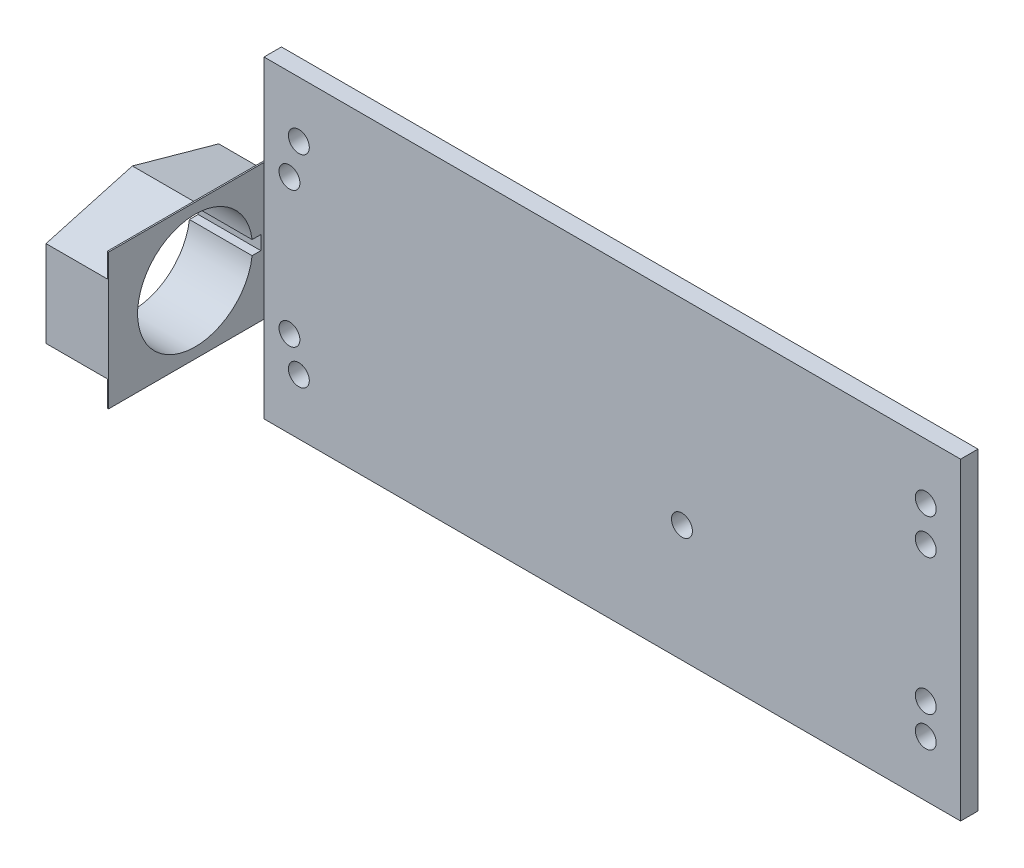
ISO-10303-21;
HEADER;
FILE_DESCRIPTION(('STEP AP214'),'2;1');
FILE_NAME('part.step','',(''),(''),'','','');
FILE_SCHEMA(('AUTOMOTIVE_DESIGN { 1 0 10303 214 1 1 1 1 }'));
ENDSEC;
DATA;
#1=APPLICATION_CONTEXT('core data for automotive mechanical design processes');
#2=APPLICATION_PROTOCOL_DEFINITION('international standard','automotive_design',2000,#1);
#3=PRODUCT_CONTEXT('',#1,'mechanical');
#4=PRODUCT('Part','Part','',(#3));
#5=PRODUCT_RELATED_PRODUCT_CATEGORY('part','',(#4));
#6=PRODUCT_DEFINITION_FORMATION('','',#4);
#7=PRODUCT_DEFINITION_CONTEXT('part definition',#1,'design');
#8=PRODUCT_DEFINITION('design','',#6,#7);
#9=PRODUCT_DEFINITION_SHAPE('','',#8);
#10=(LENGTH_UNIT() NAMED_UNIT(*) SI_UNIT(.MILLI.,.METRE.));
#11=(NAMED_UNIT(*) PLANE_ANGLE_UNIT() SI_UNIT($,.RADIAN.));
#12=(NAMED_UNIT(*) SI_UNIT($,.STERADIAN.) SOLID_ANGLE_UNIT());
#13=UNCERTAINTY_MEASURE_WITH_UNIT(LENGTH_MEASURE(1.E-05),#10,'distance_accuracy_value','');
#14=(GEOMETRIC_REPRESENTATION_CONTEXT(3) GLOBAL_UNCERTAINTY_ASSIGNED_CONTEXT((#13)) GLOBAL_UNIT_ASSIGNED_CONTEXT((#10,
#11,#12)) REPRESENTATION_CONTEXT('',''));
#15=CARTESIAN_POINT('',(0.,0.,0.));
#16=DIRECTION('',(0.,0.,1.));
#17=DIRECTION('',(1.,0.,0.));
#18=AXIS2_PLACEMENT_3D('',#15,#16,#17);
#19=CARTESIAN_POINT('',(-505.059405940594,207.518811881188,24.8));
#20=DIRECTION('',(1.,0.,0.));
#21=DIRECTION('',(0.,0.,-1.));
#22=AXIS2_PLACEMENT_3D('',#19,#20,#21);
#23=PLANE('',#22);
#24=DIRECTION('',(0.,1.,0.));
#25=VECTOR('',#24,1.);
#26=CARTESIAN_POINT('',(-505.059405940594,207.518811881188,2.95847766882047));
#27=LINE('',#26,#25);
#28=CARTESIAN_POINT('',(-505.059405940594,216.268811881188,2.95847766882046));
#29=VERTEX_POINT('',#28);
#30=CARTESIAN_POINT('',(-505.059405940594,218.268811881188,2.95847766882047));
#31=VERTEX_POINT('',#30);
#32=EDGE_CURVE('E203',#29,#31,#27,.T.);
#33=ORIENTED_EDGE('',*,*,#32,.T.);
#34=DIRECTION('',(0.,0.,1.));
#35=VECTOR('',#34,1.);
#36=CARTESIAN_POINT('',(-505.059405940594,218.268811881188,24.8));
#37=LINE('',#36,#35);
#38=CARTESIAN_POINT('',(-505.059405940594,218.268811881188,4.2108303229207));
#39=VERTEX_POINT('',#38);
#40=EDGE_CURVE('E208',#31,#39,#37,.T.);
#41=ORIENTED_EDGE('',*,*,#40,.T.);
#42=CARTESIAN_POINT('',(-505.059405940594,217.268811881188,12.4000000000003));
#43=DIRECTION('',(1.,0.,0.));
#44=DIRECTION('',(0.,0.,-1.));
#45=AXIS2_PLACEMENT_3D('',#42,#43,#44);
#46=CIRCLE('',#45,8.25);
#47=CARTESIAN_POINT('',(-505.059405940594,216.268811881188,4.2108303229207));
#48=VERTEX_POINT('',#47);
#49=EDGE_CURVE('E202',#39,#48,#46,.T.);
#50=ORIENTED_EDGE('',*,*,#49,.T.);
#51=DIRECTION('',(0.,0.,-1.));
#52=VECTOR('',#51,1.);
#53=CARTESIAN_POINT('',(-505.059405940594,216.268811881188,24.8));
#54=LINE('',#53,#52);
#55=EDGE_CURVE('E66',#48,#29,#54,.T.);
#56=ORIENTED_EDGE('',*,*,#55,.T.);
#57=EDGE_LOOP('',(#33,#41,#50,#56));
#58=FACE_BOUND('',#57,.T.);
#59=DIRECTION('',(0.,-0.281080154991242,0.959684295208638));
#60=VECTOR('',#59,1.);
#61=CARTESIAN_POINT('',(-505.059405940594,194.468447330696,56.9575032013364));
#62=LINE('',#61,#60);
#63=CARTESIAN_POINT('',(-505.059405940594,211.150624904797,0.));
#64=VERTEX_POINT('',#63);
#65=CARTESIAN_POINT('',(-505.059405940594,207.518811881188,12.4000000000001));
#66=VERTEX_POINT('',#65);
#67=EDGE_CURVE('E205',#64,#66,#62,.T.);
#68=ORIENTED_EDGE('',*,*,#67,.T.);
#69=DIRECTION('',(0.,0.281080154991242,0.959684295208638));
#70=VECTOR('',#69,1.);
#71=CARTESIAN_POINT('',(-505.059405940594,187.778691711787,-54.9981530737949));
#72=LINE('',#71,#70);
#73=CARTESIAN_POINT('',(-505.059405940594,211.150624904797,24.8));
#74=VERTEX_POINT('',#73);
#75=EDGE_CURVE('E387',#66,#74,#72,.T.);
#76=ORIENTED_EDGE('',*,*,#75,.T.);
#77=DIRECTION('',(0.,-1.,0.));
#78=VECTOR('',#77,1.);
#79=CARTESIAN_POINT('',(-505.059405940594,207.518811881188,24.8));
#80=LINE('',#79,#78);
#81=CARTESIAN_POINT('',(-505.059405940594,223.569543899469,24.8));
#82=VERTEX_POINT('',#81);
#83=EDGE_CURVE('E247',#82,#74,#80,.T.);
#84=ORIENTED_EDGE('',*,*,#83,.F.);
#85=DIRECTION('',(0.,0.267991766611294,-0.963421202293451));
#86=VECTOR('',#85,1.);
#87=CARTESIAN_POINT('',(-505.059405940594,213.915957557052,59.5043115467986));
#88=LINE('',#87,#86);
#89=CARTESIAN_POINT('',(-505.059405940594,227.018811881188,12.4000000000005));
#90=VERTEX_POINT('',#89);
#91=EDGE_CURVE('E377',#82,#90,#88,.T.);
#92=ORIENTED_EDGE('',*,*,#91,.T.);
#93=DIRECTION('',(0.,-0.267991766611294,-0.963421202293451));
#94=VECTOR('',#93,1.);
#95=CARTESIAN_POINT('',(-505.059405940594,207.512871597215,-57.7231857899069));
#96=LINE('',#95,#94);
#97=CARTESIAN_POINT('',(-505.059405940594,223.569543899469,0.));
#98=VERTEX_POINT('',#97);
#99=EDGE_CURVE('E239',#90,#98,#96,.T.);
#100=ORIENTED_EDGE('',*,*,#99,.T.);
#101=DIRECTION('',(0.,-1.,0.));
#102=VECTOR('',#101,1.);
#103=CARTESIAN_POINT('',(-505.059405940594,207.518811881188,0.));
#104=LINE('',#103,#102);
#105=EDGE_CURVE('E215',#98,#64,#104,.T.);
#106=ORIENTED_EDGE('',*,*,#105,.T.);
#107=EDGE_LOOP('',(#68,#76,#84,#92,#100,#106));
#108=FACE_BOUND('',#107,.T.);
#109=ADVANCED_FACE('F51',(#58,#108),#23,.F.);
#110=CARTESIAN_POINT('',(-496.059405940594,207.518811881188,24.8));
#111=DIRECTION('',(0.,1.,0.));
#112=DIRECTION('',(0.,0.,1.));
#113=AXIS2_PLACEMENT_3D('',#110,#111,#112);
#114=PLANE('',#113);
#115=DIRECTION('',(0.,0.,1.));
#116=VECTOR('',#115,1.);
#117=CARTESIAN_POINT('',(-496.259405940594,207.518811881188,0.));
#118=LINE('',#117,#116);
#119=CARTESIAN_POINT('',(-496.259405940594,207.518811881188,0.));
#120=VERTEX_POINT('',#119);
#121=CARTESIAN_POINT('',(-496.259405940594,207.518811881188,12.4000000000001));
#122=VERTEX_POINT('',#121);
#123=EDGE_CURVE('E74',#120,#122,#118,.T.);
#124=ORIENTED_EDGE('',*,*,#123,.F.);
#125=DIRECTION('',(1.,0.,0.));
#126=VECTOR('',#125,1.);
#127=CARTESIAN_POINT('',(-496.059405940594,207.518811881188,0.));
#128=LINE('',#127,#126);
#129=CARTESIAN_POINT('',(-496.059405940594,207.518811881188,0.));
#130=VERTEX_POINT('',#129);
#131=EDGE_CURVE('E211',#120,#130,#128,.T.);
#132=ORIENTED_EDGE('',*,*,#131,.T.);
#133=DIRECTION('',(0.,0.,-1.));
#134=VECTOR('',#133,1.);
#135=CARTESIAN_POINT('',(-496.059405940594,207.518811881188,24.8));
#136=LINE('',#135,#134);
#137=CARTESIAN_POINT('',(-496.059405940594,207.518811881188,2.50000000000001));
#138=VERTEX_POINT('',#137);
#139=EDGE_CURVE('E258',#138,#130,#136,.T.);
#140=ORIENTED_EDGE('',*,*,#139,.F.);
#141=CARTESIAN_POINT('',(-496.059405940594,207.518811881188,24.8));
#142=VERTEX_POINT('',#141);
#143=EDGE_CURVE('E251',#142,#138,#136,.T.);
#144=ORIENTED_EDGE('',*,*,#143,.F.);
#145=DIRECTION('',(1.,0.,0.));
#146=VECTOR('',#145,1.);
#147=CARTESIAN_POINT('',(-496.059405940594,207.518811881188,24.8));
#148=LINE('',#147,#146);
#149=CARTESIAN_POINT('',(-496.259405940594,207.518811881188,24.8));
#150=VERTEX_POINT('',#149);
#151=EDGE_CURVE('E250',#150,#142,#148,.T.);
#152=ORIENTED_EDGE('',*,*,#151,.F.);
#153=DIRECTION('',(0.,0.,1.));
#154=VECTOR('',#153,1.);
#155=CARTESIAN_POINT('',(-496.259405940594,207.518811881188,0.));
#156=LINE('',#155,#154);
#157=EDGE_CURVE('E394',#122,#150,#156,.T.);
#158=ORIENTED_EDGE('',*,*,#157,.F.);
#159=EDGE_LOOP('',(#124,#132,#140,#144,#152,#158));
#160=FACE_BOUND('',#159,.T.);
#161=ADVANCED_FACE('F421',(#160),#114,.F.);
#162=CARTESIAN_POINT('',(0.,0.,0.));
#163=DIRECTION('',(0.,0.,1.));
#164=DIRECTION('',(1.,0.,0.));
#165=AXIS2_PLACEMENT_3D('',#162,#163,#164);
#166=PLANE('',#165);
#167=CARTESIAN_POINT('',(-492.409405940594,227.018811881188,0.));
#168=DIRECTION('',(0.,0.,1.));
#169=DIRECTION('',(1.,0.,0.));
#170=AXIS2_PLACEMENT_3D('',#167,#168,#169);
#171=CIRCLE('',#170,1.50000000000002);
#172=CARTESIAN_POINT('',(-490.909405940594,227.018811881188,0.));
#173=VERTEX_POINT('',#172);
#174=EDGE_CURVE('E308',#173,#173,#171,.T.);
#175=ORIENTED_EDGE('',*,*,#174,.T.);
#176=EDGE_LOOP('',(#175));
#177=FACE_BOUND('',#176,.T.);
#178=CARTESIAN_POINT('',(-492.409405940594,207.518811881188,0.));
#179=DIRECTION('',(0.,0.,1.));
#180=DIRECTION('',(1.,0.,0.));
#181=AXIS2_PLACEMENT_3D('',#178,#179,#180);
#182=CIRCLE('',#181,1.50000000000002);
#183=CARTESIAN_POINT('',(-490.909405940594,207.518811881188,0.));
#184=VERTEX_POINT('',#183);
#185=EDGE_CURVE('E305',#184,#184,#182,.T.);
#186=ORIENTED_EDGE('',*,*,#185,.T.);
#187=EDGE_LOOP('',(#186));
#188=FACE_BOUND('',#187,.T.);
#189=CARTESIAN_POINT('',(-401.059405940594,227.018811881188,0.));
#190=DIRECTION('',(0.,0.,1.));
#191=DIRECTION('',(1.,0.,0.));
#192=AXIS2_PLACEMENT_3D('',#189,#190,#191);
#193=CIRCLE('',#192,1.50000000000002);
#194=CARTESIAN_POINT('',(-399.559405940594,227.018811881188,0.));
#195=VERTEX_POINT('',#194);
#196=EDGE_CURVE('E301',#195,#195,#193,.T.);
#197=ORIENTED_EDGE('',*,*,#196,.T.);
#198=EDGE_LOOP('',(#197));
#199=FACE_BOUND('',#198,.T.);
#200=CARTESIAN_POINT('',(-401.059405940594,207.518811881188,0.));
#201=DIRECTION('',(0.,0.,1.));
#202=DIRECTION('',(1.,0.,0.));
#203=AXIS2_PLACEMENT_3D('',#200,#201,#202);
#204=CIRCLE('',#203,1.50000000000002);
#205=CARTESIAN_POINT('',(-399.559405940594,207.518811881188,0.));
#206=VERTEX_POINT('',#205);
#207=EDGE_CURVE('E297',#206,#206,#204,.T.);
#208=ORIENTED_EDGE('',*,*,#207,.T.);
#209=EDGE_LOOP('',(#208));
#210=FACE_BOUND('',#209,.T.);
#211=CARTESIAN_POINT('',(-436.059405940594,211.918811881188,0.));
#212=DIRECTION('',(0.,0.,1.));
#213=DIRECTION('',(1.,0.,0.));
#214=AXIS2_PLACEMENT_3D('',#211,#212,#213);
#215=CIRCLE('',#214,1.50000000000002);
#216=CARTESIAN_POINT('',(-434.559405940594,211.918811881188,0.));
#217=VERTEX_POINT('',#216);
#218=EDGE_CURVE('E292',#217,#217,#215,.T.);
#219=ORIENTED_EDGE('',*,*,#218,.T.);
#220=EDGE_LOOP('',(#219));
#221=FACE_BOUND('',#220,.T.);
#222=CARTESIAN_POINT('',(-401.059405940594,203.118811881188,0.));
#223=DIRECTION('',(0.,0.,1.));
#224=DIRECTION('',(-1.,0.,0.));
#225=AXIS2_PLACEMENT_3D('',#222,#223,#224);
#226=CIRCLE('',#225,1.50000000000002);
#227=CARTESIAN_POINT('',(-402.559405940594,203.118811881188,0.));
#228=VERTEX_POINT('',#227);
#229=EDGE_CURVE('E745',#228,#228,#226,.T.);
#230=ORIENTED_EDGE('',*,*,#229,.T.);
#231=EDGE_LOOP('',(#230));
#232=FACE_BOUND('',#231,.T.);
#233=CARTESIAN_POINT('',(-491.059405940594,232.118811881188,0.));
#234=DIRECTION('',(0.,0.,1.));
#235=DIRECTION('',(1.,0.,0.));
#236=AXIS2_PLACEMENT_3D('',#233,#234,#235);
#237=CIRCLE('',#236,1.50000000000002);
#238=CARTESIAN_POINT('',(-489.559405940594,232.118811881188,0.));
#239=VERTEX_POINT('',#238);
#240=EDGE_CURVE('E749',#239,#239,#237,.T.);
#241=ORIENTED_EDGE('',*,*,#240,.T.);
#242=EDGE_LOOP('',(#241));
#243=FACE_BOUND('',#242,.T.);
#244=CARTESIAN_POINT('',(-491.059405940594,203.118811881188,0.));
#245=DIRECTION('',(0.,0.,1.));
#246=DIRECTION('',(1.,0.,0.));
#247=AXIS2_PLACEMENT_3D('',#244,#245,#246);
#248=CIRCLE('',#247,1.50000000000002);
#249=CARTESIAN_POINT('',(-489.559405940594,203.118811881188,0.));
#250=VERTEX_POINT('',#249);
#251=EDGE_CURVE('E753',#250,#250,#248,.T.);
#252=ORIENTED_EDGE('',*,*,#251,.T.);
#253=EDGE_LOOP('',(#252));
#254=FACE_BOUND('',#253,.T.);
#255=CARTESIAN_POINT('',(-401.059405940594,232.118811881188,0.));
#256=DIRECTION('',(0.,0.,1.));
#257=DIRECTION('',(-1.,0.,0.));
#258=AXIS2_PLACEMENT_3D('',#255,#256,#257);
#259=CIRCLE('',#258,1.50000000000002);
#260=CARTESIAN_POINT('',(-402.559405940594,232.118811881188,0.));
#261=VERTEX_POINT('',#260);
#262=EDGE_CURVE('E756',#261,#261,#259,.T.);
#263=ORIENTED_EDGE('',*,*,#262,.T.);
#264=EDGE_LOOP('',(#263));
#265=FACE_BOUND('',#264,.T.);
#266=DIRECTION('',(-1.,0.,0.));
#267=VECTOR('',#266,1.);
#268=CARTESIAN_POINT('',(-496.259405940594,211.150624904797,0.));
#269=LINE('',#268,#267);
#270=CARTESIAN_POINT('',(-496.259405940594,211.150624904797,0.));
#271=VERTEX_POINT('',#270);
#272=EDGE_CURVE('E401',#271,#64,#269,.T.);
#273=ORIENTED_EDGE('',*,*,#272,.T.);
#274=ORIENTED_EDGE('',*,*,#105,.F.);
#275=DIRECTION('',(-1.,0.,0.));
#276=VECTOR('',#275,1.);
#277=CARTESIAN_POINT('',(-496.259405940594,223.569543899469,0.));
#278=LINE('',#277,#276);
#279=CARTESIAN_POINT('',(-496.259405940594,223.569543899469,0.));
#280=VERTEX_POINT('',#279);
#281=EDGE_CURVE('E224',#280,#98,#278,.T.);
#282=ORIENTED_EDGE('',*,*,#281,.F.);
#283=DIRECTION('',(0.,-1.,0.));
#284=VECTOR('',#283,1.);
#285=CARTESIAN_POINT('',(-496.259405940594,0.,0.));
#286=LINE('',#285,#284);
#287=CARTESIAN_POINT('',(-496.259405940594,227.018811881188,0.));
#288=VERTEX_POINT('',#287);
#289=EDGE_CURVE('E236',#288,#280,#286,.T.);
#290=ORIENTED_EDGE('',*,*,#289,.F.);
#291=DIRECTION('',(-1.,0.,0.));
#292=VECTOR('',#291,1.);
#293=CARTESIAN_POINT('',(-496.059405940594,227.018811881188,0.));
#294=LINE('',#293,#292);
#295=CARTESIAN_POINT('',(-496.059405940594,227.018811881188,0.));
#296=VERTEX_POINT('',#295);
#297=EDGE_CURVE('E222',#296,#288,#294,.T.);
#298=ORIENTED_EDGE('',*,*,#297,.F.);
#299=DIRECTION('',(0.,-1.,0.));
#300=VECTOR('',#299,1.);
#301=CARTESIAN_POINT('',(-496.059405940594,240.118811881188,0.));
#302=LINE('',#301,#300);
#303=CARTESIAN_POINT('',(-496.059405940594,240.118811881188,0.));
#304=VERTEX_POINT('',#303);
#305=EDGE_CURVE('E265',#304,#296,#302,.T.);
#306=ORIENTED_EDGE('',*,*,#305,.F.);
#307=DIRECTION('',(-1.,0.,0.));
#308=VECTOR('',#307,1.);
#309=CARTESIAN_POINT('',(-496.059405940594,240.118811881188,0.));
#310=LINE('',#309,#308);
#311=CARTESIAN_POINT('',(-396.059405940594,240.118811881188,0.));
#312=VERTEX_POINT('',#311);
#313=EDGE_CURVE('E278',#312,#304,#310,.T.);
#314=ORIENTED_EDGE('',*,*,#313,.F.);
#315=DIRECTION('',(0.,1.,0.));
#316=VECTOR('',#315,1.);
#317=CARTESIAN_POINT('',(-396.059405940594,240.118811881188,0.));
#318=LINE('',#317,#316);
#319=CARTESIAN_POINT('',(-396.059405940594,195.118811881188,0.));
#320=VERTEX_POINT('',#319);
#321=EDGE_CURVE('E276',#320,#312,#318,.T.);
#322=ORIENTED_EDGE('',*,*,#321,.F.);
#323=DIRECTION('',(1.,0.,0.));
#324=VECTOR('',#323,1.);
#325=CARTESIAN_POINT('',(-496.059405940594,195.118811881188,0.));
#326=LINE('',#325,#324);
#327=CARTESIAN_POINT('',(-496.059405940594,195.118811881188,0.));
#328=VERTEX_POINT('',#327);
#329=EDGE_CURVE('E273',#328,#320,#326,.T.);
#330=ORIENTED_EDGE('',*,*,#329,.F.);
#331=EDGE_CURVE('E262',#130,#328,#302,.T.);
#332=ORIENTED_EDGE('',*,*,#331,.F.);
#333=ORIENTED_EDGE('',*,*,#131,.F.);
#334=DIRECTION('',(0.,-1.,0.));
#335=VECTOR('',#334,1.);
#336=CARTESIAN_POINT('',(-496.259405940594,0.,0.));
#337=LINE('',#336,#335);
#338=EDGE_CURVE('E398',#271,#120,#337,.T.);
#339=ORIENTED_EDGE('',*,*,#338,.F.);
#340=EDGE_LOOP('',(#273,#274,#282,#290,#298,#306,#314,#322,#330,#332,#333,#339));
#341=FACE_BOUND('',#340,.T.);
#342=ADVANCED_FACE('F352',(#177,#188,#199,#210,#221,#232,#243,#254,#265,#341),#166,.F.);
#343=CARTESIAN_POINT('',(0.,0.,24.8));
#344=DIRECTION('',(0.,0.,1.));
#345=DIRECTION('',(1.,0.,0.));
#346=AXIS2_PLACEMENT_3D('',#343,#344,#345);
#347=PLANE('',#346);
#348=ORIENTED_EDGE('',*,*,#83,.T.);
#349=DIRECTION('',(-1.,0.,0.));
#350=VECTOR('',#349,1.);
#351=CARTESIAN_POINT('',(-496.259405940594,211.150624904797,24.8));
#352=LINE('',#351,#350);
#353=CARTESIAN_POINT('',(-496.259405940594,211.150624904797,24.8));
#354=VERTEX_POINT('',#353);
#355=EDGE_CURVE('E380',#354,#74,#352,.T.);
#356=ORIENTED_EDGE('',*,*,#355,.F.);
#357=DIRECTION('',(0.,1.,0.));
#358=VECTOR('',#357,1.);
#359=CARTESIAN_POINT('',(-496.259405940594,0.,24.8));
#360=LINE('',#359,#358);
#361=EDGE_CURVE('E385',#150,#354,#360,.T.);
#362=ORIENTED_EDGE('',*,*,#361,.F.);
#363=ORIENTED_EDGE('',*,*,#151,.T.);
#364=DIRECTION('',(0.,1.,0.));
#365=VECTOR('',#364,1.);
#366=CARTESIAN_POINT('',(-496.059405940594,207.518811881188,24.8));
#367=LINE('',#366,#365);
#368=CARTESIAN_POINT('',(-496.059405940594,227.018811881188,24.8));
#369=VERTEX_POINT('',#368);
#370=EDGE_CURVE('E214',#142,#369,#367,.T.);
#371=ORIENTED_EDGE('',*,*,#370,.T.);
#372=DIRECTION('',(-1.,0.,0.));
#373=VECTOR('',#372,1.);
#374=CARTESIAN_POINT('',(-496.059405940594,227.018811881188,24.8));
#375=LINE('',#374,#373);
#376=CARTESIAN_POINT('',(-496.259405940594,227.018811881188,24.8));
#377=VERTEX_POINT('',#376);
#378=EDGE_CURVE('E244',#369,#377,#375,.T.);
#379=ORIENTED_EDGE('',*,*,#378,.T.);
#380=DIRECTION('',(0.,1.,0.));
#381=VECTOR('',#380,1.);
#382=CARTESIAN_POINT('',(-496.259405940594,0.,24.8));
#383=LINE('',#382,#381);
#384=CARTESIAN_POINT('',(-496.259405940594,223.569543899469,24.8));
#385=VERTEX_POINT('',#384);
#386=EDGE_CURVE('E372',#385,#377,#383,.T.);
#387=ORIENTED_EDGE('',*,*,#386,.F.);
#388=DIRECTION('',(-1.,0.,0.));
#389=VECTOR('',#388,1.);
#390=CARTESIAN_POINT('',(-496.259405940594,223.569543899469,24.8));
#391=LINE('',#390,#389);
#392=EDGE_CURVE('E376',#385,#82,#391,.T.);
#393=ORIENTED_EDGE('',*,*,#392,.T.);
#394=EDGE_LOOP('',(#348,#356,#362,#363,#371,#379,#387,#393));
#395=FACE_BOUND('',#394,.T.);
#396=ADVANCED_FACE('F434',(#395),#347,.T.);
#397=CARTESIAN_POINT('',(-496.059405940594,227.018811881188,24.8));
#398=DIRECTION('',(0.,-1.,0.));
#399=DIRECTION('',(0.,0.,-1.));
#400=AXIS2_PLACEMENT_3D('',#397,#398,#399);
#401=PLANE('',#400);
#402=DIRECTION('',(0.,0.,-1.));
#403=VECTOR('',#402,1.);
#404=CARTESIAN_POINT('',(-496.259405940594,227.018811881188,0.));
#405=LINE('',#404,#403);
#406=CARTESIAN_POINT('',(-496.259405940594,227.018811881188,12.4000000000005));
#407=VERTEX_POINT('',#406);
#408=EDGE_CURVE('E374',#377,#407,#405,.T.);
#409=ORIENTED_EDGE('',*,*,#408,.F.);
#410=ORIENTED_EDGE('',*,*,#378,.F.);
#411=DIRECTION('',(0.,0.,-1.));
#412=VECTOR('',#411,1.);
#413=CARTESIAN_POINT('',(-496.059405940594,227.018811881188,24.8));
#414=LINE('',#413,#412);
#415=CARTESIAN_POINT('',(-496.059405940594,227.018811881188,2.50000000000001));
#416=VERTEX_POINT('',#415);
#417=EDGE_CURVE('E255',#369,#416,#414,.T.);
#418=ORIENTED_EDGE('',*,*,#417,.T.);
#419=EDGE_CURVE('E190',#416,#296,#414,.T.);
#420=ORIENTED_EDGE('',*,*,#419,.T.);
#421=ORIENTED_EDGE('',*,*,#297,.T.);
#422=DIRECTION('',(0.,0.,-1.));
#423=VECTOR('',#422,1.);
#424=CARTESIAN_POINT('',(-496.259405940594,227.018811881188,0.));
#425=LINE('',#424,#423);
#426=EDGE_CURVE('E364',#407,#288,#425,.T.);
#427=ORIENTED_EDGE('',*,*,#426,.F.);
#428=EDGE_LOOP('',(#409,#410,#418,#420,#421,#427));
#429=FACE_BOUND('',#428,.T.);
#430=ADVANCED_FACE('F317',(#429),#401,.F.);
#431=CARTESIAN_POINT('',(-496.059405940594,240.118811881188,2.5));
#432=DIRECTION('',(1.,0.,0.));
#433=DIRECTION('',(0.,0.,-1.));
#434=AXIS2_PLACEMENT_3D('',#431,#432,#433);
#435=PLANE('',#434);
#436=ORIENTED_EDGE('',*,*,#419,.F.);
#437=DIRECTION('',(0.,-1.,0.));
#438=VECTOR('',#437,1.);
#439=CARTESIAN_POINT('',(-496.059405940594,240.118811881188,2.5));
#440=LINE('',#439,#438);
#441=CARTESIAN_POINT('',(-496.059405940594,240.118811881188,2.5));
#442=VERTEX_POINT('',#441);
#443=EDGE_CURVE('E324',#442,#416,#440,.T.);
#444=ORIENTED_EDGE('',*,*,#443,.F.);
#445=DIRECTION('',(0.,0.,-1.));
#446=VECTOR('',#445,1.);
#447=CARTESIAN_POINT('',(-496.059405940594,240.118811881188,2.5));
#448=LINE('',#447,#446);
#449=EDGE_CURVE('E281',#442,#304,#448,.T.);
#450=ORIENTED_EDGE('',*,*,#449,.T.);
#451=ORIENTED_EDGE('',*,*,#305,.T.);
#452=EDGE_LOOP('',(#436,#444,#450,#451));
#453=FACE_BOUND('',#452,.T.);
#454=ADVANCED_FACE('F323',(#453),#435,.F.);
#455=CARTESIAN_POINT('',(0.,0.,2.5));
#456=DIRECTION('',(0.,0.,1.));
#457=DIRECTION('',(1.,0.,0.));
#458=AXIS2_PLACEMENT_3D('',#455,#456,#457);
#459=PLANE('',#458);
#460=CARTESIAN_POINT('',(-492.409405940594,227.018811881188,2.5));
#461=DIRECTION('',(0.,0.,1.));
#462=DIRECTION('',(1.,0.,0.));
#463=AXIS2_PLACEMENT_3D('',#460,#461,#462);
#464=CIRCLE('',#463,1.50000000000002);
#465=CARTESIAN_POINT('',(-490.909405940594,227.018811881188,2.5));
#466=VERTEX_POINT('',#465);
#467=EDGE_CURVE('E307',#466,#466,#464,.T.);
#468=ORIENTED_EDGE('',*,*,#467,.F.);
#469=EDGE_LOOP('',(#468));
#470=FACE_BOUND('',#469,.T.);
#471=CARTESIAN_POINT('',(-492.409405940594,207.518811881188,2.5));
#472=DIRECTION('',(0.,0.,1.));
#473=DIRECTION('',(1.,0.,0.));
#474=AXIS2_PLACEMENT_3D('',#471,#472,#473);
#475=CIRCLE('',#474,1.50000000000002);
#476=CARTESIAN_POINT('',(-490.909405940594,207.518811881188,2.5));
#477=VERTEX_POINT('',#476);
#478=EDGE_CURVE('E304',#477,#477,#475,.T.);
#479=ORIENTED_EDGE('',*,*,#478,.F.);
#480=EDGE_LOOP('',(#479));
#481=FACE_BOUND('',#480,.T.);
#482=CARTESIAN_POINT('',(-401.059405940594,227.018811881188,2.5));
#483=DIRECTION('',(0.,0.,1.));
#484=DIRECTION('',(1.,0.,0.));
#485=AXIS2_PLACEMENT_3D('',#482,#483,#484);
#486=CIRCLE('',#485,1.50000000000002);
#487=CARTESIAN_POINT('',(-399.559405940594,227.018811881188,2.5));
#488=VERTEX_POINT('',#487);
#489=EDGE_CURVE('E300',#488,#488,#486,.T.);
#490=ORIENTED_EDGE('',*,*,#489,.F.);
#491=EDGE_LOOP('',(#490));
#492=FACE_BOUND('',#491,.T.);
#493=CARTESIAN_POINT('',(-401.059405940594,207.518811881188,2.5));
#494=DIRECTION('',(0.,0.,1.));
#495=DIRECTION('',(1.,0.,0.));
#496=AXIS2_PLACEMENT_3D('',#493,#494,#495);
#497=CIRCLE('',#496,1.50000000000002);
#498=CARTESIAN_POINT('',(-399.559405940594,207.518811881188,2.5));
#499=VERTEX_POINT('',#498);
#500=EDGE_CURVE('E296',#499,#499,#497,.T.);
#501=ORIENTED_EDGE('',*,*,#500,.F.);
#502=EDGE_LOOP('',(#501));
#503=FACE_BOUND('',#502,.T.);
#504=CARTESIAN_POINT('',(-436.059405940594,211.918811881188,2.5));
#505=DIRECTION('',(0.,0.,1.));
#506=DIRECTION('',(1.,0.,0.));
#507=AXIS2_PLACEMENT_3D('',#504,#505,#506);
#508=CIRCLE('',#507,1.50000000000002);
#509=CARTESIAN_POINT('',(-434.559405940594,211.918811881188,2.5));
#510=VERTEX_POINT('',#509);
#511=EDGE_CURVE('E295',#510,#510,#508,.T.);
#512=ORIENTED_EDGE('',*,*,#511,.F.);
#513=EDGE_LOOP('',(#512));
#514=FACE_BOUND('',#513,.T.);
#515=CARTESIAN_POINT('',(-401.059405940594,203.118811881188,2.5));
#516=DIRECTION('',(0.,0.,1.));
#517=DIRECTION('',(-1.,0.,0.));
#518=AXIS2_PLACEMENT_3D('',#515,#516,#517);
#519=CIRCLE('',#518,1.50000000000002);
#520=CARTESIAN_POINT('',(-402.559405940594,203.118811881188,2.5));
#521=VERTEX_POINT('',#520);
#522=EDGE_CURVE('E765',#521,#521,#519,.T.);
#523=ORIENTED_EDGE('',*,*,#522,.F.);
#524=EDGE_LOOP('',(#523));
#525=FACE_BOUND('',#524,.T.);
#526=CARTESIAN_POINT('',(-491.059405940594,232.118811881188,2.5));
#527=DIRECTION('',(0.,0.,1.));
#528=DIRECTION('',(1.,0.,0.));
#529=AXIS2_PLACEMENT_3D('',#526,#527,#528);
#530=CIRCLE('',#529,1.50000000000002);
#531=CARTESIAN_POINT('',(-489.559405940594,232.118811881188,2.5));
#532=VERTEX_POINT('',#531);
#533=EDGE_CURVE('E266',#532,#532,#530,.T.);
#534=ORIENTED_EDGE('',*,*,#533,.F.);
#535=EDGE_LOOP('',(#534));
#536=FACE_BOUND('',#535,.T.);
#537=ORIENTED_EDGE('',*,*,#443,.T.);
#538=EDGE_CURVE('E330',#416,#138,#440,.T.);
#539=ORIENTED_EDGE('',*,*,#538,.T.);
#540=CARTESIAN_POINT('',(-496.059405940594,195.118811881188,2.5));
#541=VERTEX_POINT('',#540);
#542=EDGE_CURVE('E280',#138,#541,#440,.T.);
#543=ORIENTED_EDGE('',*,*,#542,.T.);
#544=DIRECTION('',(1.,0.,0.));
#545=VECTOR('',#544,1.);
#546=CARTESIAN_POINT('',(-496.059405940594,195.118811881188,2.5));
#547=LINE('',#546,#545);
#548=CARTESIAN_POINT('',(-396.059405940594,195.118811881188,2.5));
#549=VERTEX_POINT('',#548);
#550=EDGE_CURVE('E333',#541,#549,#547,.T.);
#551=ORIENTED_EDGE('',*,*,#550,.T.);
#552=DIRECTION('',(0.,1.,0.));
#553=VECTOR('',#552,1.);
#554=CARTESIAN_POINT('',(-396.059405940594,240.118811881188,2.5));
#555=LINE('',#554,#553);
#556=CARTESIAN_POINT('',(-396.059405940594,240.118811881188,2.5));
#557=VERTEX_POINT('',#556);
#558=EDGE_CURVE('E335',#549,#557,#555,.T.);
#559=ORIENTED_EDGE('',*,*,#558,.T.);
#560=DIRECTION('',(-1.,0.,0.));
#561=VECTOR('',#560,1.);
#562=CARTESIAN_POINT('',(-496.059405940594,240.118811881188,2.5));
#563=LINE('',#562,#561);
#564=EDGE_CURVE('E271',#557,#442,#563,.T.);
#565=ORIENTED_EDGE('',*,*,#564,.T.);
#566=EDGE_LOOP('',(#537,#539,#543,#551,#559,#565));
#567=FACE_BOUND('',#566,.T.);
#568=CARTESIAN_POINT('',(-491.059405940594,203.118811881188,2.5));
#569=DIRECTION('',(0.,0.,1.));
#570=DIRECTION('',(1.,0.,0.));
#571=AXIS2_PLACEMENT_3D('',#568,#569,#570);
#572=CIRCLE('',#571,1.50000000000002);
#573=CARTESIAN_POINT('',(-489.559405940594,203.118811881188,2.5));
#574=VERTEX_POINT('',#573);
#575=EDGE_CURVE('E769',#574,#574,#572,.T.);
#576=ORIENTED_EDGE('',*,*,#575,.F.);
#577=EDGE_LOOP('',(#576));
#578=FACE_BOUND('',#577,.T.);
#579=CARTESIAN_POINT('',(-401.059405940594,232.118811881188,2.5));
#580=DIRECTION('',(0.,0.,1.));
#581=DIRECTION('',(-1.,0.,0.));
#582=AXIS2_PLACEMENT_3D('',#579,#580,#581);
#583=CIRCLE('',#582,1.50000000000002);
#584=CARTESIAN_POINT('',(-402.559405940594,232.118811881188,2.5));
#585=VERTEX_POINT('',#584);
#586=EDGE_CURVE('E758',#585,#585,#583,.T.);
#587=ORIENTED_EDGE('',*,*,#586,.F.);
#588=EDGE_LOOP('',(#587));
#589=FACE_BOUND('',#588,.T.);
#590=ADVANCED_FACE('F328',(#470,#481,#492,#503,#514,#525,#536,#567,#578,#589),#459,.T.);
#591=ORIENTED_EDGE('',*,*,#542,.F.);
#592=ORIENTED_EDGE('',*,*,#139,.T.);
#593=ORIENTED_EDGE('',*,*,#331,.T.);
#594=DIRECTION('',(0.,0.,-1.));
#595=VECTOR('',#594,1.);
#596=CARTESIAN_POINT('',(-496.059405940594,195.118811881188,2.5));
#597=LINE('',#596,#595);
#598=EDGE_CURVE('E261',#541,#328,#597,.T.);
#599=ORIENTED_EDGE('',*,*,#598,.F.);
#600=EDGE_LOOP('',(#591,#592,#593,#599));
#601=FACE_BOUND('',#600,.T.);
#602=ADVANCED_FACE('F53',(#601),#435,.F.);
#603=CARTESIAN_POINT('',(-496.059405940594,195.118811881188,2.5));
#604=DIRECTION('',(0.,1.,0.));
#605=DIRECTION('',(0.,0.,1.));
#606=AXIS2_PLACEMENT_3D('',#603,#604,#605);
#607=PLANE('',#606);
#608=ORIENTED_EDGE('',*,*,#329,.T.);
#609=DIRECTION('',(0.,0.,-1.));
#610=VECTOR('',#609,1.);
#611=CARTESIAN_POINT('',(-396.059405940594,195.118811881188,2.5));
#612=LINE('',#611,#610);
#613=EDGE_CURVE('E287',#549,#320,#612,.T.);
#614=ORIENTED_EDGE('',*,*,#613,.F.);
#615=ORIENTED_EDGE('',*,*,#550,.F.);
#616=ORIENTED_EDGE('',*,*,#598,.T.);
#617=EDGE_LOOP('',(#608,#614,#615,#616));
#618=FACE_BOUND('',#617,.T.);
#619=ADVANCED_FACE('F344',(#618),#607,.F.);
#620=CARTESIAN_POINT('',(-396.059405940594,240.118811881188,2.5));
#621=DIRECTION('',(-1.,0.,0.));
#622=DIRECTION('',(0.,-1.,0.));
#623=AXIS2_PLACEMENT_3D('',#620,#621,#622);
#624=PLANE('',#623);
#625=ORIENTED_EDGE('',*,*,#321,.T.);
#626=DIRECTION('',(0.,0.,-1.));
#627=VECTOR('',#626,1.);
#628=CARTESIAN_POINT('',(-396.059405940594,240.118811881188,2.5));
#629=LINE('',#628,#627);
#630=EDGE_CURVE('E284',#557,#312,#629,.T.);
#631=ORIENTED_EDGE('',*,*,#630,.F.);
#632=ORIENTED_EDGE('',*,*,#558,.F.);
#633=ORIENTED_EDGE('',*,*,#613,.T.);
#634=EDGE_LOOP('',(#625,#631,#632,#633));
#635=FACE_BOUND('',#634,.T.);
#636=ADVANCED_FACE('F355',(#635),#624,.F.);
#637=CARTESIAN_POINT('',(-496.059405940594,240.118811881188,2.5));
#638=DIRECTION('',(0.,-1.,0.));
#639=DIRECTION('',(1.,0.,0.));
#640=AXIS2_PLACEMENT_3D('',#637,#638,#639);
#641=PLANE('',#640);
#642=ORIENTED_EDGE('',*,*,#313,.T.);
#643=ORIENTED_EDGE('',*,*,#449,.F.);
#644=ORIENTED_EDGE('',*,*,#564,.F.);
#645=ORIENTED_EDGE('',*,*,#630,.T.);
#646=EDGE_LOOP('',(#642,#643,#644,#645));
#647=FACE_BOUND('',#646,.T.);
#648=ADVANCED_FACE('F358',(#647),#641,.F.);
#649=CARTESIAN_POINT('',(-491.059405940594,232.118811881188,2.5));
#650=DIRECTION('',(0.,0.,-1.));
#651=DIRECTION('',(-1.,0.,0.));
#652=AXIS2_PLACEMENT_3D('',#649,#650,#651);
#653=CYLINDRICAL_SURFACE('',#652,1.50000000000002);
#654=ORIENTED_EDGE('',*,*,#533,.T.);
#655=EDGE_LOOP('',(#654));
#656=FACE_BOUND('',#655,.T.);
#657=ORIENTED_EDGE('',*,*,#240,.F.);
#658=EDGE_LOOP('',(#657));
#659=FACE_BOUND('',#658,.T.);
#660=ADVANCED_FACE('F509',(#656,#659),#653,.F.);
#661=CARTESIAN_POINT('',(-491.059405940594,203.118811881188,2.5));
#662=DIRECTION('',(0.,0.,-1.));
#663=DIRECTION('',(-1.,0.,0.));
#664=AXIS2_PLACEMENT_3D('',#661,#662,#663);
#665=CYLINDRICAL_SURFACE('',#664,1.50000000000002);
#666=ORIENTED_EDGE('',*,*,#575,.T.);
#667=EDGE_LOOP('',(#666));
#668=FACE_BOUND('',#667,.T.);
#669=ORIENTED_EDGE('',*,*,#251,.F.);
#670=EDGE_LOOP('',(#669));
#671=FACE_BOUND('',#670,.T.);
#672=ADVANCED_FACE('F505',(#668,#671),#665,.F.);
#673=CARTESIAN_POINT('',(-401.059405940594,203.118811881188,2.5));
#674=DIRECTION('',(0.,0.,-1.));
#675=DIRECTION('',(-1.,0.,0.));
#676=AXIS2_PLACEMENT_3D('',#673,#674,#675);
#677=CYLINDRICAL_SURFACE('',#676,1.50000000000002);
#678=ORIENTED_EDGE('',*,*,#522,.T.);
#679=EDGE_LOOP('',(#678));
#680=FACE_BOUND('',#679,.T.);
#681=ORIENTED_EDGE('',*,*,#229,.F.);
#682=EDGE_LOOP('',(#681));
#683=FACE_BOUND('',#682,.T.);
#684=ADVANCED_FACE('F501',(#680,#683),#677,.F.);
#685=CARTESIAN_POINT('',(-401.059405940594,232.118811881188,2.5));
#686=DIRECTION('',(0.,0.,-1.));
#687=DIRECTION('',(-1.,0.,0.));
#688=AXIS2_PLACEMENT_3D('',#685,#686,#687);
#689=CYLINDRICAL_SURFACE('',#688,1.50000000000002);
#690=ORIENTED_EDGE('',*,*,#586,.T.);
#691=EDGE_LOOP('',(#690));
#692=FACE_BOUND('',#691,.T.);
#693=ORIENTED_EDGE('',*,*,#262,.F.);
#694=EDGE_LOOP('',(#693));
#695=FACE_BOUND('',#694,.T.);
#696=ADVANCED_FACE('F497',(#692,#695),#689,.F.);
#697=CARTESIAN_POINT('',(-436.059405940594,211.918811881188,-14.5));
#698=DIRECTION('',(0.,0.,1.));
#699=DIRECTION('',(1.,0.,0.));
#700=AXIS2_PLACEMENT_3D('',#697,#698,#699);
#701=CYLINDRICAL_SURFACE('',#700,1.50000000000002);
#702=ORIENTED_EDGE('',*,*,#511,.T.);
#703=EDGE_LOOP('',(#702));
#704=FACE_BOUND('',#703,.T.);
#705=ORIENTED_EDGE('',*,*,#218,.F.);
#706=EDGE_LOOP('',(#705));
#707=FACE_BOUND('',#706,.T.);
#708=ADVANCED_FACE('F493',(#704,#707),#701,.F.);
#709=CARTESIAN_POINT('',(-401.059405940594,207.518811881188,-14.5));
#710=DIRECTION('',(0.,0.,1.));
#711=DIRECTION('',(1.,0.,0.));
#712=AXIS2_PLACEMENT_3D('',#709,#710,#711);
#713=CYLINDRICAL_SURFACE('',#712,1.50000000000002);
#714=ORIENTED_EDGE('',*,*,#500,.T.);
#715=EDGE_LOOP('',(#714));
#716=FACE_BOUND('',#715,.T.);
#717=ORIENTED_EDGE('',*,*,#207,.F.);
#718=EDGE_LOOP('',(#717));
#719=FACE_BOUND('',#718,.T.);
#720=ADVANCED_FACE('F489',(#716,#719),#713,.F.);
#721=CARTESIAN_POINT('',(-401.059405940594,227.018811881188,-14.5));
#722=DIRECTION('',(0.,0.,1.));
#723=DIRECTION('',(1.,0.,0.));
#724=AXIS2_PLACEMENT_3D('',#721,#722,#723);
#725=CYLINDRICAL_SURFACE('',#724,1.50000000000002);
#726=ORIENTED_EDGE('',*,*,#489,.T.);
#727=EDGE_LOOP('',(#726));
#728=FACE_BOUND('',#727,.T.);
#729=ORIENTED_EDGE('',*,*,#196,.F.);
#730=EDGE_LOOP('',(#729));
#731=FACE_BOUND('',#730,.T.);
#732=ADVANCED_FACE('F485',(#728,#731),#725,.F.);
#733=CARTESIAN_POINT('',(-492.409405940594,207.518811881188,-14.5));
#734=DIRECTION('',(0.,0.,1.));
#735=DIRECTION('',(1.,0.,0.));
#736=AXIS2_PLACEMENT_3D('',#733,#734,#735);
#737=CYLINDRICAL_SURFACE('',#736,1.50000000000002);
#738=ORIENTED_EDGE('',*,*,#478,.T.);
#739=EDGE_LOOP('',(#738));
#740=FACE_BOUND('',#739,.T.);
#741=ORIENTED_EDGE('',*,*,#185,.F.);
#742=EDGE_LOOP('',(#741));
#743=FACE_BOUND('',#742,.T.);
#744=ADVANCED_FACE('F481',(#740,#743),#737,.F.);
#745=CARTESIAN_POINT('',(-492.409405940594,227.018811881188,-14.5));
#746=DIRECTION('',(0.,0.,1.));
#747=DIRECTION('',(1.,0.,0.));
#748=AXIS2_PLACEMENT_3D('',#745,#746,#747);
#749=CYLINDRICAL_SURFACE('',#748,1.50000000000002);
#750=ORIENTED_EDGE('',*,*,#467,.T.);
#751=EDGE_LOOP('',(#750));
#752=FACE_BOUND('',#751,.T.);
#753=ORIENTED_EDGE('',*,*,#174,.F.);
#754=EDGE_LOOP('',(#753));
#755=FACE_BOUND('',#754,.T.);
#756=ADVANCED_FACE('F478',(#752,#755),#749,.F.);
#757=CARTESIAN_POINT('',(-496.059405940594,207.518811881188,24.8));
#758=DIRECTION('',(-1.,0.,0.));
#759=DIRECTION('',(0.,0.,1.));
#760=AXIS2_PLACEMENT_3D('',#757,#758,#759);
#761=PLANE('',#760);
#762=CARTESIAN_POINT('',(-496.059405940594,217.268811881188,12.4000000000003));
#763=DIRECTION('',(-1.,0.,0.));
#764=DIRECTION('',(0.,0.,1.));
#765=AXIS2_PLACEMENT_3D('',#762,#763,#764);
#766=CIRCLE('',#765,8.25);
#767=CARTESIAN_POINT('',(-496.059405940594,216.268811881188,4.2108303229207));
#768=VERTEX_POINT('',#767);
#769=CARTESIAN_POINT('',(-496.059405940594,218.268811881188,4.2108303229207));
#770=VERTEX_POINT('',#769);
#771=EDGE_CURVE('E197',#768,#770,#766,.T.);
#772=ORIENTED_EDGE('',*,*,#771,.T.);
#773=DIRECTION('',(0.,0.,-1.));
#774=VECTOR('',#773,1.);
#775=CARTESIAN_POINT('',(-496.059405940594,218.268811881188,24.8));
#776=LINE('',#775,#774);
#777=CARTESIAN_POINT('',(-496.059405940594,218.268811881188,2.95847766882047));
#778=VERTEX_POINT('',#777);
#779=EDGE_CURVE('E407',#770,#778,#776,.T.);
#780=ORIENTED_EDGE('',*,*,#779,.T.);
#781=DIRECTION('',(0.,-1.,0.));
#782=VECTOR('',#781,1.);
#783=CARTESIAN_POINT('',(-496.059405940594,207.518811881188,2.95847766882047));
#784=LINE('',#783,#782);
#785=CARTESIAN_POINT('',(-496.059405940594,216.268811881188,2.95847766882046));
#786=VERTEX_POINT('',#785);
#787=EDGE_CURVE('E12',#778,#786,#784,.T.);
#788=ORIENTED_EDGE('',*,*,#787,.T.);
#789=DIRECTION('',(0.,0.,1.));
#790=VECTOR('',#789,1.);
#791=CARTESIAN_POINT('',(-496.059405940594,216.268811881188,24.8));
#792=LINE('',#791,#790);
#793=EDGE_CURVE('E184',#786,#768,#792,.T.);
#794=ORIENTED_EDGE('',*,*,#793,.T.);
#795=EDGE_LOOP('',(#772,#780,#788,#794));
#796=FACE_BOUND('',#795,.T.);
#797=ORIENTED_EDGE('',*,*,#538,.F.);
#798=ORIENTED_EDGE('',*,*,#417,.F.);
#799=ORIENTED_EDGE('',*,*,#370,.F.);
#800=ORIENTED_EDGE('',*,*,#143,.T.);
#801=EDGE_LOOP('',(#797,#798,#799,#800));
#802=FACE_BOUND('',#801,.T.);
#803=ADVANCED_FACE('F194',(#796,#802),#761,.F.);
#804=CARTESIAN_POINT('',(-496.259405940594,207.512871597215,-57.7231857899069));
#805=DIRECTION('',(0.,0.963421202293451,-0.267991766611293));
#806=DIRECTION('',(0.,0.267991766611294,0.963421202293451));
#807=AXIS2_PLACEMENT_3D('',#804,#805,#806);
#808=PLANE('',#807);
#809=ORIENTED_EDGE('',*,*,#99,.F.);
#810=DIRECTION('',(-1.,0.,0.));
#811=VECTOR('',#810,1.);
#812=CARTESIAN_POINT('',(-496.259405940594,227.018811881188,12.4000000000005));
#813=LINE('',#812,#811);
#814=EDGE_CURVE('E230',#407,#90,#813,.T.);
#815=ORIENTED_EDGE('',*,*,#814,.F.);
#816=DIRECTION('',(0.,-0.267991766611294,-0.963421202293451));
#817=VECTOR('',#816,1.);
#818=CARTESIAN_POINT('',(-496.259405940594,207.512871597215,-57.7231857899069));
#819=LINE('',#818,#817);
#820=EDGE_CURVE('E365',#407,#280,#819,.T.);
#821=ORIENTED_EDGE('',*,*,#820,.T.);
#822=ORIENTED_EDGE('',*,*,#281,.T.);
#823=EDGE_LOOP('',(#809,#815,#821,#822));
#824=FACE_BOUND('',#823,.T.);
#825=ADVANCED_FACE('F439',(#824),#808,.T.);
#826=CARTESIAN_POINT('',(-496.259405940594,0.,0.));
#827=DIRECTION('',(-1.,0.,0.));
#828=DIRECTION('',(0.,0.,1.));
#829=AXIS2_PLACEMENT_3D('',#826,#827,#828);
#830=PLANE('',#829);
#831=ORIENTED_EDGE('',*,*,#820,.F.);
#832=ORIENTED_EDGE('',*,*,#426,.T.);
#833=ORIENTED_EDGE('',*,*,#289,.T.);
#834=EDGE_LOOP('',(#831,#832,#833));
#835=FACE_BOUND('',#834,.T.);
#836=ADVANCED_FACE('F440',(#835),#830,.T.);
#837=CARTESIAN_POINT('',(-496.259405940594,213.915957557052,59.5043115467986));
#838=DIRECTION('',(0.,0.963421202293451,0.267991766611294));
#839=DIRECTION('',(0.,-0.267991766611294,0.963421202293451));
#840=AXIS2_PLACEMENT_3D('',#837,#838,#839);
#841=PLANE('',#840);
#842=ORIENTED_EDGE('',*,*,#91,.F.);
#843=ORIENTED_EDGE('',*,*,#392,.F.);
#844=DIRECTION('',(0.,0.267991766611294,-0.963421202293451));
#845=VECTOR('',#844,1.);
#846=CARTESIAN_POINT('',(-496.259405940594,213.915957557052,59.5043115467986));
#847=LINE('',#846,#845);
#848=EDGE_CURVE('E369',#385,#407,#847,.T.);
#849=ORIENTED_EDGE('',*,*,#848,.T.);
#850=ORIENTED_EDGE('',*,*,#814,.T.);
#851=EDGE_LOOP('',(#842,#843,#849,#850));
#852=FACE_BOUND('',#851,.T.);
#853=ADVANCED_FACE('F461',(#852),#841,.T.);
#854=CARTESIAN_POINT('',(-496.259405940594,0.,0.));
#855=DIRECTION('',(-1.,0.,0.));
#856=DIRECTION('',(0.,0.,1.));
#857=AXIS2_PLACEMENT_3D('',#854,#855,#856);
#858=PLANE('',#857);
#859=ORIENTED_EDGE('',*,*,#848,.F.);
#860=ORIENTED_EDGE('',*,*,#386,.T.);
#861=ORIENTED_EDGE('',*,*,#408,.T.);
#862=EDGE_LOOP('',(#859,#860,#861));
#863=FACE_BOUND('',#862,.T.);
#864=ADVANCED_FACE('F457',(#863),#858,.T.);
#865=CARTESIAN_POINT('',(-496.259405940594,187.778691711787,-54.9981530737949));
#866=DIRECTION('',(0.,-0.959684295208638,0.281080154991242));
#867=DIRECTION('',(0.,-0.281080154991242,-0.959684295208638));
#868=AXIS2_PLACEMENT_3D('',#865,#866,#867);
#869=PLANE('',#868);
#870=ORIENTED_EDGE('',*,*,#75,.F.);
#871=DIRECTION('',(-1.,0.,0.));
#872=VECTOR('',#871,1.);
#873=CARTESIAN_POINT('',(-496.259405940594,207.518811881188,12.4000000000001));
#874=LINE('',#873,#872);
#875=EDGE_CURVE('E383',#122,#66,#874,.T.);
#876=ORIENTED_EDGE('',*,*,#875,.F.);
#877=DIRECTION('',(0.,0.281080154991242,0.959684295208638));
#878=VECTOR('',#877,1.);
#879=CARTESIAN_POINT('',(-496.259405940594,187.778691711787,-54.9981530737949));
#880=LINE('',#879,#878);
#881=EDGE_CURVE('E390',#122,#354,#880,.T.);
#882=ORIENTED_EDGE('',*,*,#881,.T.);
#883=ORIENTED_EDGE('',*,*,#355,.T.);
#884=EDGE_LOOP('',(#870,#876,#882,#883));
#885=FACE_BOUND('',#884,.T.);
#886=ADVANCED_FACE('F428',(#885),#869,.T.);
#887=CARTESIAN_POINT('',(-496.259405940594,0.,0.));
#888=DIRECTION('',(-1.,0.,0.));
#889=DIRECTION('',(0.,0.,1.));
#890=AXIS2_PLACEMENT_3D('',#887,#888,#889);
#891=PLANE('',#890);
#892=ORIENTED_EDGE('',*,*,#881,.F.);
#893=ORIENTED_EDGE('',*,*,#157,.T.);
#894=ORIENTED_EDGE('',*,*,#361,.T.);
#895=EDGE_LOOP('',(#892,#893,#894));
#896=FACE_BOUND('',#895,.T.);
#897=ADVANCED_FACE('F449',(#896),#891,.T.);
#898=CARTESIAN_POINT('',(-496.259405940594,194.468447330696,56.9575032013364));
#899=DIRECTION('',(0.,-0.959684295208638,-0.281080154991242));
#900=DIRECTION('',(0.,0.281080154991242,-0.959684295208638));
#901=AXIS2_PLACEMENT_3D('',#898,#899,#900);
#902=PLANE('',#901);
#903=ORIENTED_EDGE('',*,*,#67,.F.);
#904=ORIENTED_EDGE('',*,*,#272,.F.);
#905=DIRECTION('',(0.,-0.281080154991242,0.959684295208638));
#906=VECTOR('',#905,1.);
#907=CARTESIAN_POINT('',(-496.259405940594,194.468447330696,56.9575032013364));
#908=LINE('',#907,#906);
#909=EDGE_CURVE('E391',#271,#122,#908,.T.);
#910=ORIENTED_EDGE('',*,*,#909,.T.);
#911=ORIENTED_EDGE('',*,*,#875,.T.);
#912=EDGE_LOOP('',(#903,#904,#910,#911));
#913=FACE_BOUND('',#912,.T.);
#914=ADVANCED_FACE('F447',(#913),#902,.T.);
#915=CARTESIAN_POINT('',(-496.259405940594,0.,0.));
#916=DIRECTION('',(-1.,0.,0.));
#917=DIRECTION('',(0.,0.,1.));
#918=AXIS2_PLACEMENT_3D('',#915,#916,#917);
#919=PLANE('',#918);
#920=ORIENTED_EDGE('',*,*,#909,.F.);
#921=ORIENTED_EDGE('',*,*,#338,.T.);
#922=ORIENTED_EDGE('',*,*,#123,.T.);
#923=EDGE_LOOP('',(#920,#921,#922));
#924=FACE_BOUND('',#923,.T.);
#925=ADVANCED_FACE('F446',(#924),#919,.T.);
#926=CARTESIAN_POINT('',(-714.8,217.268811881188,12.4000000000003));
#927=DIRECTION('',(1.,0.,0.));
#928=DIRECTION('',(0.,0.,-1.));
#929=AXIS2_PLACEMENT_3D('',#926,#927,#928);
#930=CYLINDRICAL_SURFACE('',#929,8.25);
#931=ORIENTED_EDGE('',*,*,#49,.F.);
#932=DIRECTION('',(1.,0.,0.));
#933=VECTOR('',#932,1.);
#934=CARTESIAN_POINT('',(-714.8,218.268811881188,4.2108303229207));
#935=LINE('',#934,#933);
#936=EDGE_CURVE('E59',#39,#770,#935,.T.);
#937=ORIENTED_EDGE('',*,*,#936,.T.);
#938=ORIENTED_EDGE('',*,*,#771,.F.);
#939=DIRECTION('',(1.,0.,0.));
#940=VECTOR('',#939,1.);
#941=CARTESIAN_POINT('',(-714.8,216.268811881188,4.2108303229207));
#942=LINE('',#941,#940);
#943=EDGE_CURVE('E181',#768,#48,#942,.F.);
#944=ORIENTED_EDGE('',*,*,#943,.T.);
#945=EDGE_LOOP('',(#931,#937,#938,#944));
#946=FACE_BOUND('',#945,.T.);
#947=ADVANCED_FACE('F201',(#946),#930,.F.);
#948=CARTESIAN_POINT('',(-714.8,218.268811881188,2.95847766882047));
#949=DIRECTION('',(0.,0.,-1.));
#950=DIRECTION('',(0.,1.,0.));
#951=AXIS2_PLACEMENT_3D('',#948,#949,#950);
#952=PLANE('',#951);
#953=DIRECTION('',(1.,0.,0.));
#954=VECTOR('',#953,1.);
#955=CARTESIAN_POINT('',(-714.8,216.268811881188,2.95847766882046));
#956=LINE('',#955,#954);
#957=EDGE_CURVE('E410',#29,#786,#956,.T.);
#958=ORIENTED_EDGE('',*,*,#957,.T.);
#959=ORIENTED_EDGE('',*,*,#787,.F.);
#960=DIRECTION('',(1.,0.,0.));
#961=VECTOR('',#960,1.);
#962=CARTESIAN_POINT('',(-714.8,218.268811881188,2.95847766882047));
#963=LINE('',#962,#961);
#964=EDGE_CURVE('E198',#31,#778,#963,.T.);
#965=ORIENTED_EDGE('',*,*,#964,.F.);
#966=ORIENTED_EDGE('',*,*,#32,.F.);
#967=EDGE_LOOP('',(#958,#959,#965,#966));
#968=FACE_BOUND('',#967,.T.);
#969=ADVANCED_FACE('F417',(#968),#952,.F.);
#970=CARTESIAN_POINT('',(-714.8,218.268811881188,4.2108303229207));
#971=DIRECTION('',(0.,1.,0.));
#972=DIRECTION('',(0.,0.,1.));
#973=AXIS2_PLACEMENT_3D('',#970,#971,#972);
#974=PLANE('',#973);
#975=ORIENTED_EDGE('',*,*,#964,.T.);
#976=ORIENTED_EDGE('',*,*,#779,.F.);
#977=ORIENTED_EDGE('',*,*,#936,.F.);
#978=ORIENTED_EDGE('',*,*,#40,.F.);
#979=EDGE_LOOP('',(#975,#976,#977,#978));
#980=FACE_BOUND('',#979,.T.);
#981=ADVANCED_FACE('F415',(#980),#974,.F.);
#982=CARTESIAN_POINT('',(-714.8,216.268811881188,4.2108303229207));
#983=DIRECTION('',(0.,-1.,0.));
#984=DIRECTION('',(0.,0.,-1.));
#985=AXIS2_PLACEMENT_3D('',#982,#983,#984);
#986=PLANE('',#985);
#987=ORIENTED_EDGE('',*,*,#943,.F.);
#988=ORIENTED_EDGE('',*,*,#793,.F.);
#989=ORIENTED_EDGE('',*,*,#957,.F.);
#990=ORIENTED_EDGE('',*,*,#55,.F.);
#991=EDGE_LOOP('',(#987,#988,#989,#990));
#992=FACE_BOUND('',#991,.T.);
#993=ADVANCED_FACE('F183',(#992),#986,.F.);
#994=CLOSED_SHELL('',(#109,#161,#342,#396,#430,#454,#590,#602,#619,#636,#648,#660,#672,#684,
#696,#708,#720,#732,#744,#756,#803,#825,#836,#853,#864,#886,#897,#914,#925,#947,#969,#981,#993));
#995=MANIFOLD_SOLID_BREP('B2',#994);
#996=ADVANCED_BREP_SHAPE_REPRESENTATION('',(#18,#995),#14);
#997=SHAPE_DEFINITION_REPRESENTATION(#9,#996);
ENDSEC;
END-ISO-10303-21;
